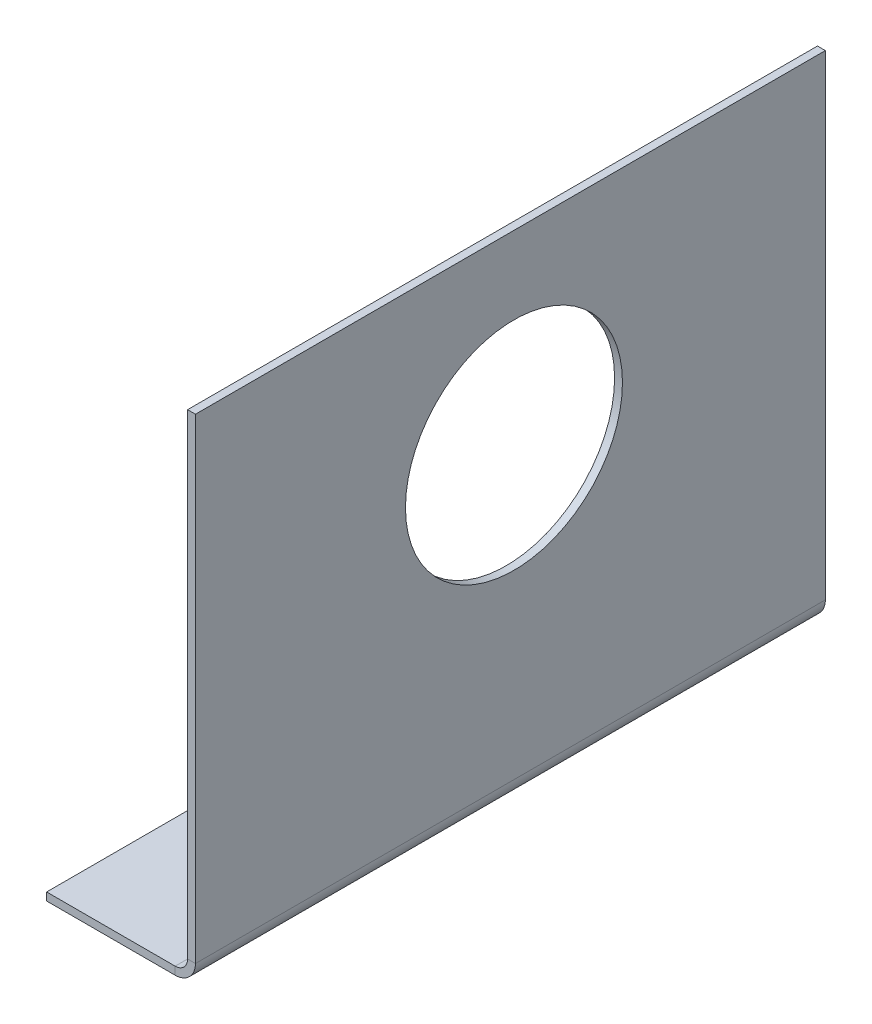
ISO-10303-21;
HEADER;
FILE_DESCRIPTION(('STEP AP214'),'2;1');
FILE_NAME('part.step','',(''),(''),'','','');
FILE_SCHEMA(('AUTOMOTIVE_DESIGN { 1 0 10303 214 1 1 1 1 }'));
ENDSEC;
DATA;
#1=APPLICATION_CONTEXT('core data for automotive mechanical design processes');
#2=APPLICATION_PROTOCOL_DEFINITION('international standard','automotive_design',2000,#1);
#3=PRODUCT_CONTEXT('',#1,'mechanical');
#4=PRODUCT('Part','Part','',(#3));
#5=PRODUCT_RELATED_PRODUCT_CATEGORY('part','',(#4));
#6=PRODUCT_DEFINITION_FORMATION('','',#4);
#7=PRODUCT_DEFINITION_CONTEXT('part definition',#1,'design');
#8=PRODUCT_DEFINITION('design','',#6,#7);
#9=PRODUCT_DEFINITION_SHAPE('','',#8);
#10=(LENGTH_UNIT() NAMED_UNIT(*) SI_UNIT(.MILLI.,.METRE.));
#11=(NAMED_UNIT(*) PLANE_ANGLE_UNIT() SI_UNIT($,.RADIAN.));
#12=(NAMED_UNIT(*) SI_UNIT($,.STERADIAN.) SOLID_ANGLE_UNIT());
#13=UNCERTAINTY_MEASURE_WITH_UNIT(LENGTH_MEASURE(1.E-05),#10,'distance_accuracy_value','');
#14=(GEOMETRIC_REPRESENTATION_CONTEXT(3) GLOBAL_UNCERTAINTY_ASSIGNED_CONTEXT((#13)) GLOBAL_UNIT_ASSIGNED_CONTEXT((#10,
#11,#12)) REPRESENTATION_CONTEXT('',''));
#15=CARTESIAN_POINT('',(0.,0.,0.));
#16=DIRECTION('',(0.,0.,1.));
#17=DIRECTION('',(1.,0.,0.));
#18=AXIS2_PLACEMENT_3D('',#15,#16,#17);
#19=CARTESIAN_POINT('',(-0.635,-20.,25.4));
#20=DIRECTION('',(0.,0.,1.));
#21=DIRECTION('',(1.,0.,0.));
#22=AXIS2_PLACEMENT_3D('',#19,#20,#21);
#23=PLANE('',#22);
#24=DIRECTION('',(0.,-1.,0.));
#25=VECTOR('',#24,1.);
#26=CARTESIAN_POINT('',(-0.635,-20.,25.4));
#27=LINE('',#26,#25);
#28=CARTESIAN_POINT('',(-0.635,20.,25.4));
#29=VERTEX_POINT('',#28);
#30=CARTESIAN_POINT('',(-0.635,-18.365,25.4));
#31=VERTEX_POINT('',#30);
#32=EDGE_CURVE('E254',#29,#31,#27,.T.);
#33=ORIENTED_EDGE('',*,*,#32,.T.);
#34=DIRECTION('',(1.,0.,0.));
#35=VECTOR('',#34,1.);
#36=CARTESIAN_POINT('',(-0.635,-18.365,25.4));
#37=LINE('',#36,#35);
#38=CARTESIAN_POINT('',(0.,-18.365,25.4));
#39=VERTEX_POINT('',#38);
#40=EDGE_CURVE('E232',#31,#39,#37,.T.);
#41=ORIENTED_EDGE('',*,*,#40,.T.);
#42=DIRECTION('',(0.,-1.,0.));
#43=VECTOR('',#42,1.);
#44=CARTESIAN_POINT('',(0.,-20.,25.4));
#45=LINE('',#44,#43);
#46=CARTESIAN_POINT('',(0.,20.,25.4));
#47=VERTEX_POINT('',#46);
#48=EDGE_CURVE('E251',#47,#39,#45,.T.);
#49=ORIENTED_EDGE('',*,*,#48,.F.);
#50=DIRECTION('',(1.,0.,0.));
#51=VECTOR('',#50,1.);
#52=CARTESIAN_POINT('',(-0.635,20.,25.4));
#53=LINE('',#52,#51);
#54=EDGE_CURVE('E13',#29,#47,#53,.T.);
#55=ORIENTED_EDGE('',*,*,#54,.F.);
#56=EDGE_LOOP('',(#33,#41,#49,#55));
#57=FACE_BOUND('',#56,.T.);
#58=ADVANCED_FACE('F64',(#57),#23,.T.);
#59=CARTESIAN_POINT('',(-0.635,0.,0.));
#60=DIRECTION('',(-1.,0.,0.));
#61=DIRECTION('',(0.,0.,1.));
#62=AXIS2_PLACEMENT_3D('',#59,#60,#61);
#63=PLANE('',#62);
#64=CARTESIAN_POINT('',(-0.635,5.,-0.287892682653744));
#65=DIRECTION('',(-1.,0.,0.));
#66=DIRECTION('',(0.,0.,1.));
#67=AXIS2_PLACEMENT_3D('',#64,#65,#66);
#68=CIRCLE('',#67,8.75);
#69=CARTESIAN_POINT('',(-0.635,5.,8.46210731734626));
#70=VERTEX_POINT('',#69);
#71=EDGE_CURVE('E192',#70,#70,#68,.T.);
#72=ORIENTED_EDGE('',*,*,#71,.F.);
#73=EDGE_LOOP('',(#72));
#74=FACE_BOUND('',#73,.T.);
#75=DIRECTION('',(0.,1.,0.));
#76=VECTOR('',#75,1.);
#77=CARTESIAN_POINT('',(-0.635,-20.,-25.4));
#78=LINE('',#77,#76);
#79=CARTESIAN_POINT('',(-0.635,-18.365,-25.4));
#80=VERTEX_POINT('',#79);
#81=CARTESIAN_POINT('',(-0.635,20.,-25.4));
#82=VERTEX_POINT('',#81);
#83=EDGE_CURVE('E248',#80,#82,#78,.T.);
#84=ORIENTED_EDGE('',*,*,#83,.F.);
#85=DIRECTION('',(0.,0.,1.));
#86=VECTOR('',#85,1.);
#87=CARTESIAN_POINT('',(-0.635,-18.365,25.4));
#88=LINE('',#87,#86);
#89=EDGE_CURVE('E238',#31,#80,#88,.F.);
#90=ORIENTED_EDGE('',*,*,#89,.F.);
#91=ORIENTED_EDGE('',*,*,#32,.F.);
#92=DIRECTION('',(0.,0.,1.));
#93=VECTOR('',#92,1.);
#94=CARTESIAN_POINT('',(-0.635,20.,25.4));
#95=LINE('',#94,#93);
#96=EDGE_CURVE('E250',#82,#29,#95,.T.);
#97=ORIENTED_EDGE('',*,*,#96,.F.);
#98=EDGE_LOOP('',(#84,#90,#91,#97));
#99=FACE_BOUND('',#98,.T.);
#100=ADVANCED_FACE('F315',(#74,#99),#63,.T.);
#101=CARTESIAN_POINT('',(0.,0.,0.));
#102=DIRECTION('',(-1.,0.,0.));
#103=DIRECTION('',(0.,0.,1.));
#104=AXIS2_PLACEMENT_3D('',#101,#102,#103);
#105=PLANE('',#104);
#106=CARTESIAN_POINT('',(0.,5.,-0.287892682653744));
#107=DIRECTION('',(1.,0.,0.));
#108=DIRECTION('',(0.,0.,-1.));
#109=AXIS2_PLACEMENT_3D('',#106,#107,#108);
#110=CIRCLE('',#109,8.75);
#111=CARTESIAN_POINT('',(0.,5.,-9.03789268265375));
#112=VERTEX_POINT('',#111);
#113=EDGE_CURVE('E189',#112,#112,#110,.T.);
#114=ORIENTED_EDGE('',*,*,#113,.F.);
#115=EDGE_LOOP('',(#114));
#116=FACE_BOUND('',#115,.T.);
#117=DIRECTION('',(0.,0.,1.));
#118=VECTOR('',#117,1.);
#119=CARTESIAN_POINT('',(0.,-18.365,25.4));
#120=LINE('',#119,#118);
#121=CARTESIAN_POINT('',(0.,-18.365,-25.4));
#122=VERTEX_POINT('',#121);
#123=EDGE_CURVE('E226',#39,#122,#120,.F.);
#124=ORIENTED_EDGE('',*,*,#123,.T.);
#125=DIRECTION('',(0.,1.,0.));
#126=VECTOR('',#125,1.);
#127=CARTESIAN_POINT('',(0.,-20.,-25.4));
#128=LINE('',#127,#126);
#129=CARTESIAN_POINT('',(0.,20.,-25.4));
#130=VERTEX_POINT('',#129);
#131=EDGE_CURVE('E246',#122,#130,#128,.T.);
#132=ORIENTED_EDGE('',*,*,#131,.T.);
#133=DIRECTION('',(0.,0.,1.));
#134=VECTOR('',#133,1.);
#135=CARTESIAN_POINT('',(0.,20.,25.4));
#136=LINE('',#135,#134);
#137=EDGE_CURVE('E258',#130,#47,#136,.T.);
#138=ORIENTED_EDGE('',*,*,#137,.T.);
#139=ORIENTED_EDGE('',*,*,#48,.T.);
#140=EDGE_LOOP('',(#124,#132,#138,#139));
#141=FACE_BOUND('',#140,.T.);
#142=ADVANCED_FACE('F265',(#116,#141),#105,.F.);
#143=CARTESIAN_POINT('',(-0.635,-20.,-25.4));
#144=DIRECTION('',(0.,0.,-1.));
#145=DIRECTION('',(-1.,0.,0.));
#146=AXIS2_PLACEMENT_3D('',#143,#144,#145);
#147=PLANE('',#146);
#148=DIRECTION('',(1.,0.,0.));
#149=VECTOR('',#148,1.);
#150=CARTESIAN_POINT('',(-0.635,-18.365,-25.4));
#151=LINE('',#150,#149);
#152=EDGE_CURVE('E243',#80,#122,#151,.T.);
#153=ORIENTED_EDGE('',*,*,#152,.F.);
#154=ORIENTED_EDGE('',*,*,#83,.T.);
#155=DIRECTION('',(1.,0.,0.));
#156=VECTOR('',#155,1.);
#157=CARTESIAN_POINT('',(-0.635,20.,-25.4));
#158=LINE('',#157,#156);
#159=EDGE_CURVE('E68',#82,#130,#158,.T.);
#160=ORIENTED_EDGE('',*,*,#159,.T.);
#161=ORIENTED_EDGE('',*,*,#131,.F.);
#162=EDGE_LOOP('',(#153,#154,#160,#161));
#163=FACE_BOUND('',#162,.T.);
#164=ADVANCED_FACE('F66',(#163),#147,.T.);
#165=CARTESIAN_POINT('',(-0.635,20.,25.4));
#166=DIRECTION('',(0.,1.,0.));
#167=DIRECTION('',(0.,0.,1.));
#168=AXIS2_PLACEMENT_3D('',#165,#166,#167);
#169=PLANE('',#168);
#170=ORIENTED_EDGE('',*,*,#137,.F.);
#171=ORIENTED_EDGE('',*,*,#159,.F.);
#172=ORIENTED_EDGE('',*,*,#96,.T.);
#173=ORIENTED_EDGE('',*,*,#54,.T.);
#174=EDGE_LOOP('',(#170,#171,#172,#173));
#175=FACE_BOUND('',#174,.T.);
#176=ADVANCED_FACE('F325',(#175),#169,.T.);
#177=CARTESIAN_POINT('',(-1.635,-18.365,-25.4));
#178=DIRECTION('',(0.,0.,-1.));
#179=DIRECTION('',(-1.,0.,0.));
#180=AXIS2_PLACEMENT_3D('',#177,#178,#179);
#181=PLANE('',#180);
#182=DIRECTION('',(0.,1.,0.));
#183=VECTOR('',#182,1.);
#184=CARTESIAN_POINT('',(-1.635,-20.,-25.4));
#185=LINE('',#184,#183);
#186=CARTESIAN_POINT('',(-1.635,-19.365,-25.4));
#187=VERTEX_POINT('',#186);
#188=CARTESIAN_POINT('',(-1.635,-20.,-25.4));
#189=VERTEX_POINT('',#188);
#190=EDGE_CURVE('E195',#187,#189,#185,.F.);
#191=ORIENTED_EDGE('',*,*,#190,.F.);
#192=CARTESIAN_POINT('',(-1.635,-18.365,-25.4));
#193=DIRECTION('',(0.,0.,1.));
#194=DIRECTION('',(1.,0.,0.));
#195=AXIS2_PLACEMENT_3D('',#192,#193,#194);
#196=CIRCLE('',#195,1.);
#197=EDGE_CURVE('E235',#80,#187,#196,.F.);
#198=ORIENTED_EDGE('',*,*,#197,.F.);
#199=ORIENTED_EDGE('',*,*,#152,.T.);
#200=CARTESIAN_POINT('',(-1.635,-18.365,-25.4));
#201=DIRECTION('',(0.,0.,1.));
#202=DIRECTION('',(1.,0.,0.));
#203=AXIS2_PLACEMENT_3D('',#200,#201,#202);
#204=CIRCLE('',#203,1.635);
#205=EDGE_CURVE('E228',#122,#189,#204,.F.);
#206=ORIENTED_EDGE('',*,*,#205,.T.);
#207=EDGE_LOOP('',(#191,#198,#199,#206));
#208=FACE_BOUND('',#207,.T.);
#209=ADVANCED_FACE('F296',(#208),#181,.T.);
#210=CARTESIAN_POINT('',(-1.635,-18.365,25.4));
#211=DIRECTION('',(0.,0.,-1.));
#212=DIRECTION('',(-1.,0.,0.));
#213=AXIS2_PLACEMENT_3D('',#210,#211,#212);
#214=PLANE('',#213);
#215=CARTESIAN_POINT('',(-1.635,-18.365,25.4));
#216=DIRECTION('',(0.,0.,1.));
#217=DIRECTION('',(1.,0.,0.));
#218=AXIS2_PLACEMENT_3D('',#215,#216,#217);
#219=CIRCLE('',#218,1.);
#220=CARTESIAN_POINT('',(-1.635,-19.365,25.4));
#221=VERTEX_POINT('',#220);
#222=EDGE_CURVE('E199',#221,#31,#219,.T.);
#223=ORIENTED_EDGE('',*,*,#222,.F.);
#224=DIRECTION('',(0.,1.,0.));
#225=VECTOR('',#224,1.);
#226=CARTESIAN_POINT('',(-1.635,-19.365,25.4));
#227=LINE('',#226,#225);
#228=CARTESIAN_POINT('',(-1.635,-20.,25.4));
#229=VERTEX_POINT('',#228);
#230=EDGE_CURVE('E219',#221,#229,#227,.F.);
#231=ORIENTED_EDGE('',*,*,#230,.T.);
#232=CARTESIAN_POINT('',(-1.635,-18.365,25.4));
#233=DIRECTION('',(0.,0.,1.));
#234=DIRECTION('',(1.,0.,0.));
#235=AXIS2_PLACEMENT_3D('',#232,#233,#234);
#236=CIRCLE('',#235,1.635);
#237=EDGE_CURVE('E229',#229,#39,#236,.T.);
#238=ORIENTED_EDGE('',*,*,#237,.T.);
#239=ORIENTED_EDGE('',*,*,#40,.F.);
#240=EDGE_LOOP('',(#223,#231,#238,#239));
#241=FACE_BOUND('',#240,.T.);
#242=ADVANCED_FACE('F275',(#241),#214,.F.);
#243=CARTESIAN_POINT('',(-1.635,-18.365,25.4));
#244=DIRECTION('',(0.,0.,1.));
#245=DIRECTION('',(0.,-1.,0.));
#246=AXIS2_PLACEMENT_3D('',#243,#244,#245);
#247=CYLINDRICAL_SURFACE('',#246,1.635);
#248=ORIENTED_EDGE('',*,*,#123,.F.);
#249=ORIENTED_EDGE('',*,*,#237,.F.);
#250=DIRECTION('',(0.,0.,1.));
#251=VECTOR('',#250,1.);
#252=CARTESIAN_POINT('',(-1.635,-20.,-25.4));
#253=LINE('',#252,#251);
#254=EDGE_CURVE('E217',#229,#189,#253,.F.);
#255=ORIENTED_EDGE('',*,*,#254,.T.);
#256=ORIENTED_EDGE('',*,*,#205,.F.);
#257=EDGE_LOOP('',(#248,#249,#255,#256));
#258=FACE_BOUND('',#257,.T.);
#259=ADVANCED_FACE('F271',(#258),#247,.T.);
#260=CARTESIAN_POINT('',(-1.635,-18.365,25.4));
#261=DIRECTION('',(0.,0.,1.));
#262=DIRECTION('',(0.,-1.,0.));
#263=AXIS2_PLACEMENT_3D('',#260,#261,#262);
#264=CYLINDRICAL_SURFACE('',#263,1.);
#265=ORIENTED_EDGE('',*,*,#89,.T.);
#266=ORIENTED_EDGE('',*,*,#197,.T.);
#267=DIRECTION('',(0.,0.,1.));
#268=VECTOR('',#267,1.);
#269=CARTESIAN_POINT('',(-1.635,-19.365,-25.4));
#270=LINE('',#269,#268);
#271=EDGE_CURVE('E222',#187,#221,#270,.T.);
#272=ORIENTED_EDGE('',*,*,#271,.T.);
#273=ORIENTED_EDGE('',*,*,#222,.T.);
#274=EDGE_LOOP('',(#265,#266,#272,#273));
#275=FACE_BOUND('',#274,.T.);
#276=ADVANCED_FACE('F299',(#275),#264,.F.);
#277=CARTESIAN_POINT('',(-12.,-20.,25.4));
#278=DIRECTION('',(0.,0.,-1.));
#279=DIRECTION('',(-1.,0.,0.));
#280=AXIS2_PLACEMENT_3D('',#277,#278,#279);
#281=PLANE('',#280);
#282=ORIENTED_EDGE('',*,*,#230,.F.);
#283=DIRECTION('',(1.,0.,0.));
#284=VECTOR('',#283,1.);
#285=CARTESIAN_POINT('',(-12.,-19.365,25.4));
#286=LINE('',#285,#284);
#287=CARTESIAN_POINT('',(-12.,-19.365,25.4));
#288=VERTEX_POINT('',#287);
#289=EDGE_CURVE('E215',#221,#288,#286,.F.);
#290=ORIENTED_EDGE('',*,*,#289,.T.);
#291=DIRECTION('',(0.,1.,0.));
#292=VECTOR('',#291,1.);
#293=CARTESIAN_POINT('',(-12.,-20.,25.4));
#294=LINE('',#293,#292);
#295=CARTESIAN_POINT('',(-12.,-20.,25.4));
#296=VERTEX_POINT('',#295);
#297=EDGE_CURVE('E196',#296,#288,#294,.T.);
#298=ORIENTED_EDGE('',*,*,#297,.F.);
#299=DIRECTION('',(-1.,0.,0.));
#300=VECTOR('',#299,1.);
#301=CARTESIAN_POINT('',(0.,-20.,25.4));
#302=LINE('',#301,#300);
#303=EDGE_CURVE('E208',#229,#296,#302,.T.);
#304=ORIENTED_EDGE('',*,*,#303,.F.);
#305=EDGE_LOOP('',(#282,#290,#298,#304));
#306=FACE_BOUND('',#305,.T.);
#307=ADVANCED_FACE('F285',(#306),#281,.F.);
#308=CARTESIAN_POINT('',(-0.634999999999998,-20.,-25.4));
#309=DIRECTION('',(0.,0.,1.));
#310=DIRECTION('',(1.,0.,0.));
#311=AXIS2_PLACEMENT_3D('',#308,#309,#310);
#312=PLANE('',#311);
#313=ORIENTED_EDGE('',*,*,#190,.T.);
#314=DIRECTION('',(1.,0.,0.));
#315=VECTOR('',#314,1.);
#316=CARTESIAN_POINT('',(0.,-20.,-25.4));
#317=LINE('',#316,#315);
#318=CARTESIAN_POINT('',(-12.,-20.,-25.4));
#319=VERTEX_POINT('',#318);
#320=EDGE_CURVE('E203',#319,#189,#317,.T.);
#321=ORIENTED_EDGE('',*,*,#320,.F.);
#322=DIRECTION('',(0.,1.,0.));
#323=VECTOR('',#322,1.);
#324=CARTESIAN_POINT('',(-12.,-20.,-25.4));
#325=LINE('',#324,#323);
#326=CARTESIAN_POINT('',(-12.,-19.365,-25.4));
#327=VERTEX_POINT('',#326);
#328=EDGE_CURVE('E200',#319,#327,#325,.T.);
#329=ORIENTED_EDGE('',*,*,#328,.T.);
#330=DIRECTION('',(-1.,0.,0.));
#331=VECTOR('',#330,1.);
#332=CARTESIAN_POINT('',(-0.635,-19.365,-25.4));
#333=LINE('',#332,#331);
#334=EDGE_CURVE('E210',#327,#187,#333,.F.);
#335=ORIENTED_EDGE('',*,*,#334,.T.);
#336=EDGE_LOOP('',(#313,#321,#329,#335));
#337=FACE_BOUND('',#336,.T.);
#338=ADVANCED_FACE('F293',(#337),#312,.F.);
#339=CARTESIAN_POINT('',(0.,-20.,0.));
#340=DIRECTION('',(0.,1.,0.));
#341=DIRECTION('',(-1.,0.,0.));
#342=AXIS2_PLACEMENT_3D('',#339,#340,#341);
#343=PLANE('',#342);
#344=CARTESIAN_POINT('',(-6.8175,-20.0000000000001,-12.));
#345=DIRECTION('',(0.,1.,0.));
#346=DIRECTION('',(-1.,0.,0.));
#347=AXIS2_PLACEMENT_3D('',#344,#345,#346);
#348=CIRCLE('',#347,2.65);
#349=CARTESIAN_POINT('',(-9.4675,-20.0000000000001,-12.));
#350=VERTEX_POINT('',#349);
#351=EDGE_CURVE('E176',#350,#350,#348,.T.);
#352=ORIENTED_EDGE('',*,*,#351,.T.);
#353=EDGE_LOOP('',(#352));
#354=FACE_BOUND('',#353,.T.);
#355=DIRECTION('',(0.,0.,-1.));
#356=VECTOR('',#355,1.);
#357=CARTESIAN_POINT('',(-4.1675,-20.,9.5));
#358=LINE('',#357,#356);
#359=CARTESIAN_POINT('',(-4.1675,-20.,14.5));
#360=VERTEX_POINT('',#359);
#361=CARTESIAN_POINT('',(-4.1675,-20.,9.5));
#362=VERTEX_POINT('',#361);
#363=EDGE_CURVE('E181',#360,#362,#358,.T.);
#364=ORIENTED_EDGE('',*,*,#363,.T.);
#365=CARTESIAN_POINT('',(-6.8175,-20.0000000000001,9.5));
#366=DIRECTION('',(0.,1.,0.));
#367=DIRECTION('',(-1.,0.,0.));
#368=AXIS2_PLACEMENT_3D('',#365,#366,#367);
#369=CIRCLE('',#368,2.65);
#370=CARTESIAN_POINT('',(-9.4675,-20.0000000000001,9.5));
#371=VERTEX_POINT('',#370);
#372=EDGE_CURVE('E154',#362,#371,#369,.T.);
#373=ORIENTED_EDGE('',*,*,#372,.T.);
#374=DIRECTION('',(0.,0.,1.));
#375=VECTOR('',#374,1.);
#376=CARTESIAN_POINT('',(-9.4675,-20.0000000000001,9.5));
#377=LINE('',#376,#375);
#378=CARTESIAN_POINT('',(-9.4675,-20.,14.5));
#379=VERTEX_POINT('',#378);
#380=EDGE_CURVE('E185',#371,#379,#377,.T.);
#381=ORIENTED_EDGE('',*,*,#380,.T.);
#382=CARTESIAN_POINT('',(-6.8175,-20.0000000000001,14.5));
#383=DIRECTION('',(0.,1.,0.));
#384=DIRECTION('',(-1.,0.,0.));
#385=AXIS2_PLACEMENT_3D('',#382,#383,#384);
#386=CIRCLE('',#385,2.65);
#387=EDGE_CURVE('E79',#379,#360,#386,.T.);
#388=ORIENTED_EDGE('',*,*,#387,.T.);
#389=EDGE_LOOP('',(#364,#373,#381,#388));
#390=FACE_BOUND('',#389,.T.);
#391=ORIENTED_EDGE('',*,*,#254,.F.);
#392=ORIENTED_EDGE('',*,*,#303,.T.);
#393=DIRECTION('',(0.,0.,-1.));
#394=VECTOR('',#393,1.);
#395=CARTESIAN_POINT('',(-12.,-20.,0.));
#396=LINE('',#395,#394);
#397=EDGE_CURVE('E206',#296,#319,#396,.T.);
#398=ORIENTED_EDGE('',*,*,#397,.T.);
#399=ORIENTED_EDGE('',*,*,#320,.T.);
#400=EDGE_LOOP('',(#391,#392,#398,#399));
#401=FACE_BOUND('',#400,.T.);
#402=ADVANCED_FACE('F282',(#354,#390,#401),#343,.F.);
#403=CARTESIAN_POINT('',(0.,-19.365,0.));
#404=DIRECTION('',(0.,1.,0.));
#405=DIRECTION('',(-1.,0.,0.));
#406=AXIS2_PLACEMENT_3D('',#403,#404,#405);
#407=PLANE('',#406);
#408=CARTESIAN_POINT('',(-6.81750000000001,-19.365,-12.));
#409=DIRECTION('',(0.,1.,0.));
#410=DIRECTION('',(-1.,0.,0.));
#411=AXIS2_PLACEMENT_3D('',#408,#409,#410);
#412=CIRCLE('',#411,2.65);
#413=CARTESIAN_POINT('',(-9.4675,-19.365,-12.));
#414=VERTEX_POINT('',#413);
#415=EDGE_CURVE('E173',#414,#414,#412,.T.);
#416=ORIENTED_EDGE('',*,*,#415,.F.);
#417=EDGE_LOOP('',(#416));
#418=FACE_BOUND('',#417,.T.);
#419=CARTESIAN_POINT('',(-6.8175,-19.365,9.5));
#420=DIRECTION('',(0.,1.,0.));
#421=DIRECTION('',(-1.,0.,0.));
#422=AXIS2_PLACEMENT_3D('',#419,#420,#421);
#423=CIRCLE('',#422,2.65);
#424=CARTESIAN_POINT('',(-4.1675,-19.365,9.5));
#425=VERTEX_POINT('',#424);
#426=CARTESIAN_POINT('',(-9.4675,-19.365,9.5));
#427=VERTEX_POINT('',#426);
#428=EDGE_CURVE('E87',#425,#427,#423,.T.);
#429=ORIENTED_EDGE('',*,*,#428,.F.);
#430=DIRECTION('',(0.,0.,-1.));
#431=VECTOR('',#430,1.);
#432=CARTESIAN_POINT('',(-4.1675,-19.365,9.5));
#433=LINE('',#432,#431);
#434=CARTESIAN_POINT('',(-4.1675,-19.365,14.5));
#435=VERTEX_POINT('',#434);
#436=EDGE_CURVE('E161',#435,#425,#433,.T.);
#437=ORIENTED_EDGE('',*,*,#436,.F.);
#438=CARTESIAN_POINT('',(-6.8175,-19.365,14.5));
#439=DIRECTION('',(0.,1.,0.));
#440=DIRECTION('',(-1.,0.,0.));
#441=AXIS2_PLACEMENT_3D('',#438,#439,#440);
#442=CIRCLE('',#441,2.65);
#443=CARTESIAN_POINT('',(-9.4675,-19.365,14.5));
#444=VERTEX_POINT('',#443);
#445=EDGE_CURVE('E166',#444,#435,#442,.T.);
#446=ORIENTED_EDGE('',*,*,#445,.F.);
#447=DIRECTION('',(0.,0.,1.));
#448=VECTOR('',#447,1.);
#449=CARTESIAN_POINT('',(-9.4675,-19.365,9.5));
#450=LINE('',#449,#448);
#451=EDGE_CURVE('E172',#427,#444,#450,.T.);
#452=ORIENTED_EDGE('',*,*,#451,.F.);
#453=EDGE_LOOP('',(#429,#437,#446,#452));
#454=FACE_BOUND('',#453,.T.);
#455=ORIENTED_EDGE('',*,*,#289,.F.);
#456=ORIENTED_EDGE('',*,*,#271,.F.);
#457=ORIENTED_EDGE('',*,*,#334,.F.);
#458=DIRECTION('',(0.,0.,1.));
#459=VECTOR('',#458,1.);
#460=CARTESIAN_POINT('',(-12.,-19.365,-25.4));
#461=LINE('',#460,#459);
#462=EDGE_CURVE('E213',#288,#327,#461,.F.);
#463=ORIENTED_EDGE('',*,*,#462,.F.);
#464=EDGE_LOOP('',(#455,#456,#457,#463));
#465=FACE_BOUND('',#464,.T.);
#466=ADVANCED_FACE('F169',(#418,#454,#465),#407,.T.);
#467=CARTESIAN_POINT('',(-12.,-20.,-25.4));
#468=DIRECTION('',(1.,0.,0.));
#469=DIRECTION('',(0.,1.,0.));
#470=AXIS2_PLACEMENT_3D('',#467,#468,#469);
#471=PLANE('',#470);
#472=ORIENTED_EDGE('',*,*,#462,.T.);
#473=ORIENTED_EDGE('',*,*,#328,.F.);
#474=ORIENTED_EDGE('',*,*,#397,.F.);
#475=ORIENTED_EDGE('',*,*,#297,.T.);
#476=EDGE_LOOP('',(#472,#473,#474,#475));
#477=FACE_BOUND('',#476,.T.);
#478=ADVANCED_FACE('F290',(#477),#471,.F.);
#479=CARTESIAN_POINT('',(-12.,5.,-0.287892682653744));
#480=DIRECTION('',(1.,0.,0.));
#481=DIRECTION('',(0.,0.,-1.));
#482=AXIS2_PLACEMENT_3D('',#479,#480,#481);
#483=CYLINDRICAL_SURFACE('',#482,8.75);
#484=ORIENTED_EDGE('',*,*,#71,.T.);
#485=EDGE_LOOP('',(#484));
#486=FACE_BOUND('',#485,.T.);
#487=ORIENTED_EDGE('',*,*,#113,.T.);
#488=EDGE_LOOP('',(#487));
#489=FACE_BOUND('',#488,.T.);
#490=ADVANCED_FACE('F308',(#486,#489),#483,.F.);
#491=CARTESIAN_POINT('',(-6.8175,-20.0000000000001,9.5));
#492=DIRECTION('',(0.,1.,0.));
#493=DIRECTION('',(-1.,0.,0.));
#494=AXIS2_PLACEMENT_3D('',#491,#492,#493);
#495=CYLINDRICAL_SURFACE('',#494,2.65);
#496=ORIENTED_EDGE('',*,*,#428,.T.);
#497=DIRECTION('',(0.,1.,0.));
#498=VECTOR('',#497,1.);
#499=CARTESIAN_POINT('',(-9.4675,-20.0000000000001,9.5));
#500=LINE('',#499,#498);
#501=EDGE_CURVE('E183',#371,#427,#500,.T.);
#502=ORIENTED_EDGE('',*,*,#501,.F.);
#503=ORIENTED_EDGE('',*,*,#372,.F.);
#504=DIRECTION('',(0.,1.,0.));
#505=VECTOR('',#504,1.);
#506=CARTESIAN_POINT('',(-4.1675,-20.,9.5));
#507=LINE('',#506,#505);
#508=EDGE_CURVE('E150',#362,#425,#507,.T.);
#509=ORIENTED_EDGE('',*,*,#508,.T.);
#510=EDGE_LOOP('',(#496,#502,#503,#509));
#511=FACE_BOUND('',#510,.T.);
#512=ADVANCED_FACE('F152',(#511),#495,.F.);
#513=CARTESIAN_POINT('',(-4.1675,-20.,9.5));
#514=DIRECTION('',(1.,0.,0.));
#515=DIRECTION('',(0.,1.,0.));
#516=AXIS2_PLACEMENT_3D('',#513,#514,#515);
#517=PLANE('',#516);
#518=ORIENTED_EDGE('',*,*,#436,.T.);
#519=ORIENTED_EDGE('',*,*,#508,.F.);
#520=ORIENTED_EDGE('',*,*,#363,.F.);
#521=DIRECTION('',(0.,1.,0.));
#522=VECTOR('',#521,1.);
#523=CARTESIAN_POINT('',(-4.1675,-20.,14.5));
#524=LINE('',#523,#522);
#525=EDGE_CURVE('E158',#360,#435,#524,.T.);
#526=ORIENTED_EDGE('',*,*,#525,.T.);
#527=EDGE_LOOP('',(#518,#519,#520,#526));
#528=FACE_BOUND('',#527,.T.);
#529=ADVANCED_FACE('F162',(#528),#517,.F.);
#530=CARTESIAN_POINT('',(-6.8175,-20.0000000000001,14.5));
#531=DIRECTION('',(0.,1.,0.));
#532=DIRECTION('',(-1.,0.,0.));
#533=AXIS2_PLACEMENT_3D('',#530,#531,#532);
#534=CYLINDRICAL_SURFACE('',#533,2.65);
#535=ORIENTED_EDGE('',*,*,#445,.T.);
#536=ORIENTED_EDGE('',*,*,#525,.F.);
#537=ORIENTED_EDGE('',*,*,#387,.F.);
#538=DIRECTION('',(0.,1.,0.));
#539=VECTOR('',#538,1.);
#540=CARTESIAN_POINT('',(-9.4675,-20.0000000000001,14.5));
#541=LINE('',#540,#539);
#542=EDGE_CURVE('E373',#379,#444,#541,.T.);
#543=ORIENTED_EDGE('',*,*,#542,.T.);
#544=EDGE_LOOP('',(#535,#536,#537,#543));
#545=FACE_BOUND('',#544,.T.);
#546=ADVANCED_FACE('F355',(#545),#534,.F.);
#547=CARTESIAN_POINT('',(-9.4675,-20.0000000000001,9.5));
#548=DIRECTION('',(-1.,0.,0.));
#549=DIRECTION('',(0.,-1.,0.));
#550=AXIS2_PLACEMENT_3D('',#547,#548,#549);
#551=PLANE('',#550);
#552=ORIENTED_EDGE('',*,*,#451,.T.);
#553=ORIENTED_EDGE('',*,*,#542,.F.);
#554=ORIENTED_EDGE('',*,*,#380,.F.);
#555=ORIENTED_EDGE('',*,*,#501,.T.);
#556=EDGE_LOOP('',(#552,#553,#554,#555));
#557=FACE_BOUND('',#556,.T.);
#558=ADVANCED_FACE('F358',(#557),#551,.F.);
#559=CARTESIAN_POINT('',(-6.8175,-20.0000000000001,-12.));
#560=DIRECTION('',(0.,1.,0.));
#561=DIRECTION('',(-1.,0.,0.));
#562=AXIS2_PLACEMENT_3D('',#559,#560,#561);
#563=CYLINDRICAL_SURFACE('',#562,2.65);
#564=ORIENTED_EDGE('',*,*,#351,.F.);
#565=EDGE_LOOP('',(#564));
#566=FACE_BOUND('',#565,.T.);
#567=ORIENTED_EDGE('',*,*,#415,.T.);
#568=EDGE_LOOP('',(#567));
#569=FACE_BOUND('',#568,.T.);
#570=ADVANCED_FACE('F360',(#566,#569),#563,.F.);
#571=CLOSED_SHELL('',(#58,#100,#142,#164,#176,#209,#242,#259,#276,#307,#338,#402,#466,#478,#490,
#512,#529,#546,#558,#570));
#572=MANIFOLD_SOLID_BREP('B2',#571);
#573=ADVANCED_BREP_SHAPE_REPRESENTATION('',(#18,#572),#14);
#574=SHAPE_DEFINITION_REPRESENTATION(#9,#573);
ENDSEC;
END-ISO-10303-21;
